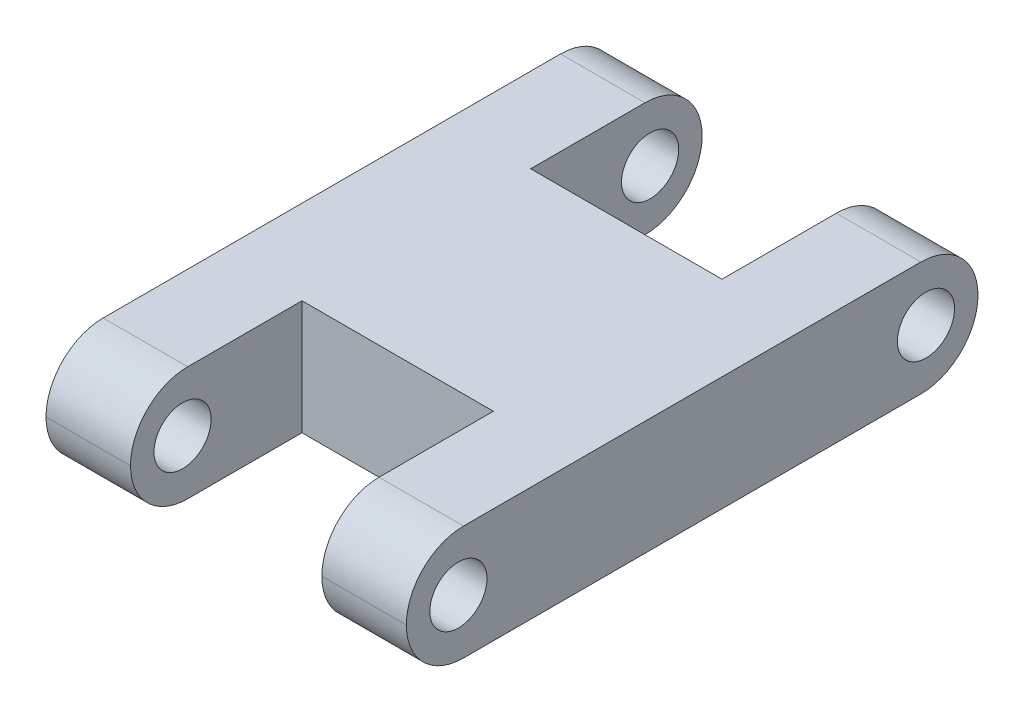
ISO-10303-21;
HEADER;
FILE_DESCRIPTION(('STEP AP214'),'2;1');
FILE_NAME('part.step','',(''),(''),'','','');
FILE_SCHEMA(('AUTOMOTIVE_DESIGN { 1 0 10303 214 1 1 1 1 }'));
ENDSEC;
DATA;
#1=APPLICATION_CONTEXT('core data for automotive mechanical design processes');
#2=APPLICATION_PROTOCOL_DEFINITION('international standard','automotive_design',2000,#1);
#3=PRODUCT_CONTEXT('',#1,'mechanical');
#4=PRODUCT('Part','Part','',(#3));
#5=PRODUCT_RELATED_PRODUCT_CATEGORY('part','',(#4));
#6=PRODUCT_DEFINITION_FORMATION('','',#4);
#7=PRODUCT_DEFINITION_CONTEXT('part definition',#1,'design');
#8=PRODUCT_DEFINITION('design','',#6,#7);
#9=PRODUCT_DEFINITION_SHAPE('','',#8);
#10=(LENGTH_UNIT() NAMED_UNIT(*) SI_UNIT(.MILLI.,.METRE.));
#11=(NAMED_UNIT(*) PLANE_ANGLE_UNIT() SI_UNIT($,.RADIAN.));
#12=(NAMED_UNIT(*) SI_UNIT($,.STERADIAN.) SOLID_ANGLE_UNIT());
#13=UNCERTAINTY_MEASURE_WITH_UNIT(LENGTH_MEASURE(1.E-05),#10,'distance_accuracy_value','');
#14=(GEOMETRIC_REPRESENTATION_CONTEXT(3) GLOBAL_UNCERTAINTY_ASSIGNED_CONTEXT((#13)) GLOBAL_UNIT_ASSIGNED_CONTEXT((#10,
#11,#12)) REPRESENTATION_CONTEXT('',''));
#15=CARTESIAN_POINT('',(0.,0.,0.));
#16=DIRECTION('',(0.,0.,1.));
#17=DIRECTION('',(1.,0.,0.));
#18=AXIS2_PLACEMENT_3D('',#15,#16,#17);
#19=CARTESIAN_POINT('',(7.39220194828621,10.,0.));
#20=DIRECTION('',(-1.,0.,0.));
#21=DIRECTION('',(0.,0.,1.));
#22=AXIS2_PLACEMENT_3D('',#19,#20,#21);
#23=PLANE('',#22);
#24=CARTESIAN_POINT('',(7.39220194828621,5.,4.55217439058586));
#25=DIRECTION('',(-1.,0.,0.));
#26=DIRECTION('',(0.,0.,1.));
#27=AXIS2_PLACEMENT_3D('',#24,#25,#26);
#28=CIRCLE('',#27,2.5);
#29=CARTESIAN_POINT('',(7.39220194828621,5.,7.05217439058586));
#30=VERTEX_POINT('',#29);
#31=EDGE_CURVE('E271',#30,#30,#28,.T.);
#32=ORIENTED_EDGE('',*,*,#31,.T.);
#33=EDGE_LOOP('',(#32));
#34=FACE_BOUND('',#33,.T.);
#35=DIRECTION('',(0.,0.,-1.));
#36=VECTOR('',#35,1.);
#37=CARTESIAN_POINT('',(7.39220194828621,0.,0.));
#38=LINE('',#37,#36);
#39=CARTESIAN_POINT('',(7.39220194828621,0.,15.));
#40=VERTEX_POINT('',#39);
#41=CARTESIAN_POINT('',(7.39220194828621,0.,5.));
#42=VERTEX_POINT('',#41);
#43=EDGE_CURVE('E190',#40,#42,#38,.T.);
#44=ORIENTED_EDGE('',*,*,#43,.T.);
#45=CARTESIAN_POINT('',(7.39220194828621,5.,5.));
#46=DIRECTION('',(-1.,0.,0.));
#47=DIRECTION('',(0.,0.,1.));
#48=AXIS2_PLACEMENT_3D('',#45,#46,#47);
#49=CIRCLE('',#48,5.);
#50=CARTESIAN_POINT('',(7.39220194828621,5.,0.));
#51=VERTEX_POINT('',#50);
#52=EDGE_CURVE('E11',#42,#51,#49,.F.);
#53=ORIENTED_EDGE('',*,*,#52,.T.);
#54=CARTESIAN_POINT('',(7.39220194828621,5.,5.));
#55=DIRECTION('',(-1.,0.,0.));
#56=DIRECTION('',(0.,0.,1.));
#57=AXIS2_PLACEMENT_3D('',#54,#55,#56);
#58=CIRCLE('',#57,5.);
#59=CARTESIAN_POINT('',(7.39220194828621,10.,5.));
#60=VERTEX_POINT('',#59);
#61=EDGE_CURVE('E46',#51,#60,#58,.F.);
#62=ORIENTED_EDGE('',*,*,#61,.T.);
#63=DIRECTION('',(0.,0.,-1.));
#64=VECTOR('',#63,1.);
#65=CARTESIAN_POINT('',(7.39220194828621,10.,0.));
#66=LINE('',#65,#64);
#67=CARTESIAN_POINT('',(7.39220194828621,10.,15.));
#68=VERTEX_POINT('',#67);
#69=EDGE_CURVE('E209',#68,#60,#66,.T.);
#70=ORIENTED_EDGE('',*,*,#69,.F.);
#71=DIRECTION('',(0.,-1.,0.));
#72=VECTOR('',#71,1.);
#73=CARTESIAN_POINT('',(7.39220194828621,10.,15.));
#74=LINE('',#73,#72);
#75=EDGE_CURVE('E189',#68,#40,#74,.T.);
#76=ORIENTED_EDGE('',*,*,#75,.T.);
#77=EDGE_LOOP('',(#44,#53,#62,#70,#76));
#78=FACE_BOUND('',#77,.T.);
#79=ADVANCED_FACE('F37',(#34,#78),#23,.F.);
#80=CARTESIAN_POINT('',(0.,10.,0.));
#81=DIRECTION('',(1.,0.,0.));
#82=DIRECTION('',(0.,0.,-1.));
#83=AXIS2_PLACEMENT_3D('',#80,#81,#82);
#84=PLANE('',#83);
#85=CARTESIAN_POINT('',(0.,5.,45.4478256094141));
#86=DIRECTION('',(-1.,0.,0.));
#87=DIRECTION('',(0.,0.,-1.));
#88=AXIS2_PLACEMENT_3D('',#85,#86,#87);
#89=CIRCLE('',#88,2.49999999999999);
#90=CARTESIAN_POINT('',(0.,5.,42.9478256094141));
#91=VERTEX_POINT('',#90);
#92=EDGE_CURVE('E516',#91,#91,#89,.T.);
#93=ORIENTED_EDGE('',*,*,#92,.F.);
#94=EDGE_LOOP('',(#93));
#95=FACE_BOUND('',#94,.T.);
#96=CARTESIAN_POINT('',(0.,5.,4.55217439058586));
#97=DIRECTION('',(-1.,0.,0.));
#98=DIRECTION('',(0.,0.,1.));
#99=AXIS2_PLACEMENT_3D('',#96,#97,#98);
#100=CIRCLE('',#99,2.5);
#101=CARTESIAN_POINT('',(0.,5.,7.05217439058586));
#102=VERTEX_POINT('',#101);
#103=EDGE_CURVE('E275',#102,#102,#100,.T.);
#104=ORIENTED_EDGE('',*,*,#103,.F.);
#105=EDGE_LOOP('',(#104));
#106=FACE_BOUND('',#105,.T.);
#107=DIRECTION('',(0.,0.,1.));
#108=VECTOR('',#107,1.);
#109=CARTESIAN_POINT('',(0.,0.,0.));
#110=LINE('',#109,#108);
#111=CARTESIAN_POINT('',(0.,0.,5.));
#112=VERTEX_POINT('',#111);
#113=CARTESIAN_POINT('',(0.,0.,45.));
#114=VERTEX_POINT('',#113);
#115=EDGE_CURVE('E192',#112,#114,#110,.T.);
#116=ORIENTED_EDGE('',*,*,#115,.T.);
#117=CARTESIAN_POINT('',(0.,5.,45.));
#118=DIRECTION('',(1.,0.,0.));
#119=DIRECTION('',(0.,0.,-1.));
#120=AXIS2_PLACEMENT_3D('',#117,#118,#119);
#121=CIRCLE('',#120,5.);
#122=CARTESIAN_POINT('',(0.,5.,50.));
#123=VERTEX_POINT('',#122);
#124=EDGE_CURVE('E247',#114,#123,#121,.F.);
#125=ORIENTED_EDGE('',*,*,#124,.T.);
#126=CARTESIAN_POINT('',(0.,5.,45.));
#127=DIRECTION('',(1.,0.,0.));
#128=DIRECTION('',(0.,0.,-1.));
#129=AXIS2_PLACEMENT_3D('',#126,#127,#128);
#130=CIRCLE('',#129,5.);
#131=CARTESIAN_POINT('',(0.,10.,45.));
#132=VERTEX_POINT('',#131);
#133=EDGE_CURVE('E245',#123,#132,#130,.F.);
#134=ORIENTED_EDGE('',*,*,#133,.T.);
#135=DIRECTION('',(0.,0.,1.));
#136=VECTOR('',#135,1.);
#137=CARTESIAN_POINT('',(0.,10.,0.));
#138=LINE('',#137,#136);
#139=CARTESIAN_POINT('',(0.,10.,5.));
#140=VERTEX_POINT('',#139);
#141=EDGE_CURVE('E162',#140,#132,#138,.T.);
#142=ORIENTED_EDGE('',*,*,#141,.F.);
#143=CARTESIAN_POINT('',(0.,5.,5.));
#144=DIRECTION('',(1.,0.,0.));
#145=DIRECTION('',(0.,0.,-1.));
#146=AXIS2_PLACEMENT_3D('',#143,#144,#145);
#147=CIRCLE('',#146,5.);
#148=CARTESIAN_POINT('',(0.,5.,0.));
#149=VERTEX_POINT('',#148);
#150=EDGE_CURVE('E241',#140,#149,#147,.F.);
#151=ORIENTED_EDGE('',*,*,#150,.T.);
#152=CARTESIAN_POINT('',(0.,5.,5.));
#153=DIRECTION('',(1.,0.,0.));
#154=DIRECTION('',(0.,0.,-1.));
#155=AXIS2_PLACEMENT_3D('',#152,#153,#154);
#156=CIRCLE('',#155,5.);
#157=EDGE_CURVE('E243',#149,#112,#156,.F.);
#158=ORIENTED_EDGE('',*,*,#157,.T.);
#159=EDGE_LOOP('',(#116,#125,#134,#142,#151,#158));
#160=FACE_BOUND('',#159,.T.);
#161=ADVANCED_FACE('F308',(#95,#106,#160),#84,.F.);
#162=CARTESIAN_POINT('',(7.39220194828623,10.,0.));
#163=DIRECTION('',(-1.,0.,0.));
#164=DIRECTION('',(0.,0.,1.));
#165=AXIS2_PLACEMENT_3D('',#162,#163,#164);
#166=PLANE('',#165);
#167=CARTESIAN_POINT('',(7.39220194828623,5.,45.4478256094141));
#168=DIRECTION('',(-1.,0.,0.));
#169=DIRECTION('',(0.,0.,1.));
#170=AXIS2_PLACEMENT_3D('',#167,#168,#169);
#171=CIRCLE('',#170,2.49999999999999);
#172=CARTESIAN_POINT('',(7.39220194828623,5.,47.9478256094141));
#173=VERTEX_POINT('',#172);
#174=EDGE_CURVE('E281',#173,#173,#171,.T.);
#175=ORIENTED_EDGE('',*,*,#174,.T.);
#176=EDGE_LOOP('',(#175));
#177=FACE_BOUND('',#176,.T.);
#178=CARTESIAN_POINT('',(7.39220194828623,5.,45.));
#179=DIRECTION('',(-1.,0.,0.));
#180=DIRECTION('',(0.,0.,1.));
#181=AXIS2_PLACEMENT_3D('',#178,#179,#180);
#182=CIRCLE('',#181,5.);
#183=CARTESIAN_POINT('',(7.39220194828623,10.,45.));
#184=VERTEX_POINT('',#183);
#185=CARTESIAN_POINT('',(7.39220194828623,5.,50.));
#186=VERTEX_POINT('',#185);
#187=EDGE_CURVE('E237',#184,#186,#182,.F.);
#188=ORIENTED_EDGE('',*,*,#187,.T.);
#189=CARTESIAN_POINT('',(7.39220194828623,5.,45.));
#190=DIRECTION('',(-1.,0.,0.));
#191=DIRECTION('',(0.,0.,1.));
#192=AXIS2_PLACEMENT_3D('',#189,#190,#191);
#193=CIRCLE('',#192,5.);
#194=CARTESIAN_POINT('',(7.39220194828623,0.,45.));
#195=VERTEX_POINT('',#194);
#196=EDGE_CURVE('E239',#186,#195,#193,.F.);
#197=ORIENTED_EDGE('',*,*,#196,.T.);
#198=DIRECTION('',(0.,0.,-1.));
#199=VECTOR('',#198,1.);
#200=CARTESIAN_POINT('',(7.39220194828623,0.,0.));
#201=LINE('',#200,#199);
#202=CARTESIAN_POINT('',(7.39220194828623,0.,35.));
#203=VERTEX_POINT('',#202);
#204=EDGE_CURVE('E168',#195,#203,#201,.T.);
#205=ORIENTED_EDGE('',*,*,#204,.T.);
#206=DIRECTION('',(0.,-1.,0.));
#207=VECTOR('',#206,1.);
#208=CARTESIAN_POINT('',(7.39220194828623,10.,35.));
#209=LINE('',#208,#207);
#210=CARTESIAN_POINT('',(7.39220194828623,10.,35.));
#211=VERTEX_POINT('',#210);
#212=EDGE_CURVE('E165',#211,#203,#209,.T.);
#213=ORIENTED_EDGE('',*,*,#212,.F.);
#214=DIRECTION('',(0.,0.,-1.));
#215=VECTOR('',#214,1.);
#216=CARTESIAN_POINT('',(7.39220194828623,10.,0.));
#217=LINE('',#216,#215);
#218=EDGE_CURVE('E150',#184,#211,#217,.T.);
#219=ORIENTED_EDGE('',*,*,#218,.F.);
#220=EDGE_LOOP('',(#188,#197,#205,#213,#219));
#221=FACE_BOUND('',#220,.T.);
#222=ADVANCED_FACE('F166',(#177,#221),#166,.F.);
#223=CARTESIAN_POINT('',(0.,10.,35.));
#224=DIRECTION('',(0.,0.,-1.));
#225=DIRECTION('',(-1.,0.,0.));
#226=AXIS2_PLACEMENT_3D('',#223,#224,#225);
#227=PLANE('',#226);
#228=DIRECTION('',(1.,0.,0.));
#229=VECTOR('',#228,1.);
#230=CARTESIAN_POINT('',(0.,0.,35.));
#231=LINE('',#230,#229);
#232=CARTESIAN_POINT('',(24.1278451788051,0.,35.));
#233=VERTEX_POINT('',#232);
#234=EDGE_CURVE('E197',#203,#233,#231,.T.);
#235=ORIENTED_EDGE('',*,*,#234,.T.);
#236=DIRECTION('',(0.,-1.,0.));
#237=VECTOR('',#236,1.);
#238=CARTESIAN_POINT('',(24.1278451788051,10.,35.));
#239=LINE('',#238,#237);
#240=CARTESIAN_POINT('',(24.1278451788051,10.,35.));
#241=VERTEX_POINT('',#240);
#242=EDGE_CURVE('E173',#241,#233,#239,.T.);
#243=ORIENTED_EDGE('',*,*,#242,.F.);
#244=DIRECTION('',(1.,0.,0.));
#245=VECTOR('',#244,1.);
#246=CARTESIAN_POINT('',(0.,10.,35.));
#247=LINE('',#246,#245);
#248=EDGE_CURVE('E156',#211,#241,#247,.T.);
#249=ORIENTED_EDGE('',*,*,#248,.F.);
#250=ORIENTED_EDGE('',*,*,#212,.T.);
#251=EDGE_LOOP('',(#235,#243,#249,#250));
#252=FACE_BOUND('',#251,.T.);
#253=ADVANCED_FACE('F175',(#252),#227,.F.);
#254=CARTESIAN_POINT('',(24.1278451788051,10.,0.));
#255=DIRECTION('',(-1.,0.,0.));
#256=DIRECTION('',(0.,0.,1.));
#257=AXIS2_PLACEMENT_3D('',#254,#255,#256);
#258=PLANE('',#257);
#259=CARTESIAN_POINT('',(24.1278451788051,5.,45.4478256094141));
#260=DIRECTION('',(-1.,0.,0.));
#261=DIRECTION('',(0.,0.,1.));
#262=AXIS2_PLACEMENT_3D('',#259,#260,#261);
#263=CIRCLE('',#262,2.49999999999999);
#264=CARTESIAN_POINT('',(24.1278451788051,5.,47.9478256094141));
#265=VERTEX_POINT('',#264);
#266=EDGE_CURVE('E286',#265,#265,#263,.T.);
#267=ORIENTED_EDGE('',*,*,#266,.F.);
#268=EDGE_LOOP('',(#267));
#269=FACE_BOUND('',#268,.T.);
#270=DIRECTION('',(0.,0.,-1.));
#271=VECTOR('',#270,1.);
#272=CARTESIAN_POINT('',(24.1278451788051,0.,0.));
#273=LINE('',#272,#271);
#274=CARTESIAN_POINT('',(24.1278451788051,0.,45.));
#275=VERTEX_POINT('',#274);
#276=EDGE_CURVE('E199',#275,#233,#273,.T.);
#277=ORIENTED_EDGE('',*,*,#276,.F.);
#278=CARTESIAN_POINT('',(24.1278451788051,5.,45.));
#279=DIRECTION('',(-1.,0.,0.));
#280=DIRECTION('',(0.,0.,1.));
#281=AXIS2_PLACEMENT_3D('',#278,#279,#280);
#282=CIRCLE('',#281,5.);
#283=CARTESIAN_POINT('',(24.1278451788051,5.,50.));
#284=VERTEX_POINT('',#283);
#285=EDGE_CURVE('E227',#275,#284,#282,.T.);
#286=ORIENTED_EDGE('',*,*,#285,.T.);
#287=CARTESIAN_POINT('',(24.1278451788051,5.,45.));
#288=DIRECTION('',(-1.,0.,0.));
#289=DIRECTION('',(0.,0.,1.));
#290=AXIS2_PLACEMENT_3D('',#287,#288,#289);
#291=CIRCLE('',#290,5.);
#292=CARTESIAN_POINT('',(24.1278451788051,10.,45.));
#293=VERTEX_POINT('',#292);
#294=EDGE_CURVE('E225',#284,#293,#291,.T.);
#295=ORIENTED_EDGE('',*,*,#294,.T.);
#296=DIRECTION('',(0.,0.,-1.));
#297=VECTOR('',#296,1.);
#298=CARTESIAN_POINT('',(24.1278451788051,10.,0.));
#299=LINE('',#298,#297);
#300=EDGE_CURVE('E177',#293,#241,#299,.T.);
#301=ORIENTED_EDGE('',*,*,#300,.T.);
#302=ORIENTED_EDGE('',*,*,#242,.T.);
#303=EDGE_LOOP('',(#277,#286,#295,#301,#302));
#304=FACE_BOUND('',#303,.T.);
#305=ADVANCED_FACE('F350',(#269,#304),#258,.T.);
#306=CARTESIAN_POINT('',(31.5200471270914,10.,0.));
#307=DIRECTION('',(1.,0.,0.));
#308=DIRECTION('',(0.,0.,-1.));
#309=AXIS2_PLACEMENT_3D('',#306,#307,#308);
#310=PLANE('',#309);
#311=CARTESIAN_POINT('',(31.5200471270914,5.,45.4478256094141));
#312=DIRECTION('',(1.,0.,0.));
#313=DIRECTION('',(0.,0.,-1.));
#314=AXIS2_PLACEMENT_3D('',#311,#312,#313);
#315=CIRCLE('',#314,2.49999999999999);
#316=CARTESIAN_POINT('',(31.5200471270914,5.,42.9478256094141));
#317=VERTEX_POINT('',#316);
#318=EDGE_CURVE('E41',#317,#317,#315,.T.);
#319=ORIENTED_EDGE('',*,*,#318,.F.);
#320=EDGE_LOOP('',(#319));
#321=FACE_BOUND('',#320,.T.);
#322=CARTESIAN_POINT('',(31.5200471270914,5.,4.55217439058586));
#323=DIRECTION('',(1.,0.,0.));
#324=DIRECTION('',(0.,0.,-1.));
#325=AXIS2_PLACEMENT_3D('',#322,#323,#324);
#326=CIRCLE('',#325,2.5);
#327=CARTESIAN_POINT('',(31.5200471270914,5.,2.05217439058586));
#328=VERTEX_POINT('',#327);
#329=EDGE_CURVE('E274',#328,#328,#326,.T.);
#330=ORIENTED_EDGE('',*,*,#329,.F.);
#331=EDGE_LOOP('',(#330));
#332=FACE_BOUND('',#331,.T.);
#333=CARTESIAN_POINT('',(31.5200471270914,5.,45.));
#334=DIRECTION('',(1.,0.,0.));
#335=DIRECTION('',(0.,0.,-1.));
#336=AXIS2_PLACEMENT_3D('',#333,#334,#335);
#337=CIRCLE('',#336,5.);
#338=CARTESIAN_POINT('',(31.5200471270914,10.,45.));
#339=VERTEX_POINT('',#338);
#340=CARTESIAN_POINT('',(31.5200471270914,5.,50.));
#341=VERTEX_POINT('',#340);
#342=EDGE_CURVE('E233',#339,#341,#337,.T.);
#343=ORIENTED_EDGE('',*,*,#342,.T.);
#344=CARTESIAN_POINT('',(31.5200471270914,5.,45.));
#345=DIRECTION('',(1.,0.,0.));
#346=DIRECTION('',(0.,0.,-1.));
#347=AXIS2_PLACEMENT_3D('',#344,#345,#346);
#348=CIRCLE('',#347,5.);
#349=CARTESIAN_POINT('',(31.5200471270914,0.,45.));
#350=VERTEX_POINT('',#349);
#351=EDGE_CURVE('E235',#341,#350,#348,.T.);
#352=ORIENTED_EDGE('',*,*,#351,.T.);
#353=DIRECTION('',(0.,0.,1.));
#354=VECTOR('',#353,1.);
#355=CARTESIAN_POINT('',(31.5200471270914,0.,0.));
#356=LINE('',#355,#354);
#357=CARTESIAN_POINT('',(31.5200471270914,0.,5.));
#358=VERTEX_POINT('',#357);
#359=EDGE_CURVE('E201',#358,#350,#356,.T.);
#360=ORIENTED_EDGE('',*,*,#359,.F.);
#361=CARTESIAN_POINT('',(31.5200471270914,5.,5.));
#362=DIRECTION('',(1.,0.,0.));
#363=DIRECTION('',(0.,0.,-1.));
#364=AXIS2_PLACEMENT_3D('',#361,#362,#363);
#365=CIRCLE('',#364,5.);
#366=CARTESIAN_POINT('',(31.5200471270914,5.,0.));
#367=VERTEX_POINT('',#366);
#368=EDGE_CURVE('E229',#358,#367,#365,.T.);
#369=ORIENTED_EDGE('',*,*,#368,.T.);
#370=CARTESIAN_POINT('',(31.5200471270914,5.,5.));
#371=DIRECTION('',(1.,0.,0.));
#372=DIRECTION('',(0.,0.,-1.));
#373=AXIS2_PLACEMENT_3D('',#370,#371,#372);
#374=CIRCLE('',#373,5.);
#375=CARTESIAN_POINT('',(31.5200471270914,10.,5.));
#376=VERTEX_POINT('',#375);
#377=EDGE_CURVE('E231',#367,#376,#374,.T.);
#378=ORIENTED_EDGE('',*,*,#377,.T.);
#379=DIRECTION('',(0.,0.,1.));
#380=VECTOR('',#379,1.);
#381=CARTESIAN_POINT('',(31.5200471270914,10.,0.));
#382=LINE('',#381,#380);
#383=EDGE_CURVE('E179',#376,#339,#382,.T.);
#384=ORIENTED_EDGE('',*,*,#383,.T.);
#385=EDGE_LOOP('',(#343,#352,#360,#369,#378,#384));
#386=FACE_BOUND('',#385,.T.);
#387=ADVANCED_FACE('F336',(#321,#332,#386),#310,.T.);
#388=CARTESIAN_POINT('',(24.1278451788052,10.,0.));
#389=DIRECTION('',(-1.,0.,0.));
#390=DIRECTION('',(0.,0.,1.));
#391=AXIS2_PLACEMENT_3D('',#388,#389,#390);
#392=PLANE('',#391);
#393=CARTESIAN_POINT('',(24.1278451788052,5.,4.55217439058586));
#394=DIRECTION('',(-1.,0.,0.));
#395=DIRECTION('',(0.,0.,1.));
#396=AXIS2_PLACEMENT_3D('',#393,#394,#395);
#397=CIRCLE('',#396,2.5);
#398=CARTESIAN_POINT('',(24.1278451788052,5.,7.05217439058586));
#399=VERTEX_POINT('',#398);
#400=EDGE_CURVE('E272',#399,#399,#397,.T.);
#401=ORIENTED_EDGE('',*,*,#400,.F.);
#402=EDGE_LOOP('',(#401));
#403=FACE_BOUND('',#402,.T.);
#404=DIRECTION('',(0.,0.,-1.));
#405=VECTOR('',#404,1.);
#406=CARTESIAN_POINT('',(24.1278451788052,10.,0.));
#407=LINE('',#406,#405);
#408=CARTESIAN_POINT('',(24.1278451788052,10.,15.));
#409=VERTEX_POINT('',#408);
#410=CARTESIAN_POINT('',(24.1278451788052,10.,5.));
#411=VERTEX_POINT('',#410);
#412=EDGE_CURVE('E185',#409,#411,#407,.T.);
#413=ORIENTED_EDGE('',*,*,#412,.T.);
#414=CARTESIAN_POINT('',(24.1278451788052,5.,5.));
#415=DIRECTION('',(-1.,0.,0.));
#416=DIRECTION('',(0.,0.,1.));
#417=AXIS2_PLACEMENT_3D('',#414,#415,#416);
#418=CIRCLE('',#417,5.);
#419=CARTESIAN_POINT('',(24.1278451788052,5.,0.));
#420=VERTEX_POINT('',#419);
#421=EDGE_CURVE('E60',#411,#420,#418,.T.);
#422=ORIENTED_EDGE('',*,*,#421,.T.);
#423=CARTESIAN_POINT('',(24.1278451788052,5.,5.));
#424=DIRECTION('',(-1.,0.,0.));
#425=DIRECTION('',(0.,0.,1.));
#426=AXIS2_PLACEMENT_3D('',#423,#424,#425);
#427=CIRCLE('',#426,5.);
#428=CARTESIAN_POINT('',(24.1278451788052,0.,5.));
#429=VERTEX_POINT('',#428);
#430=EDGE_CURVE('E257',#420,#429,#427,.T.);
#431=ORIENTED_EDGE('',*,*,#430,.T.);
#432=DIRECTION('',(0.,0.,-1.));
#433=VECTOR('',#432,1.);
#434=CARTESIAN_POINT('',(24.1278451788052,0.,0.));
#435=LINE('',#434,#433);
#436=CARTESIAN_POINT('',(24.1278451788052,0.,15.));
#437=VERTEX_POINT('',#436);
#438=EDGE_CURVE('E204',#437,#429,#435,.T.);
#439=ORIENTED_EDGE('',*,*,#438,.F.);
#440=DIRECTION('',(0.,-1.,0.));
#441=VECTOR('',#440,1.);
#442=CARTESIAN_POINT('',(24.1278451788052,10.,15.));
#443=LINE('',#442,#441);
#444=EDGE_CURVE('E212',#409,#437,#443,.T.);
#445=ORIENTED_EDGE('',*,*,#444,.F.);
#446=EDGE_LOOP('',(#413,#422,#431,#439,#445));
#447=FACE_BOUND('',#446,.T.);
#448=ADVANCED_FACE('F325',(#403,#447),#392,.T.);
#449=CARTESIAN_POINT('',(0.,10.,15.));
#450=DIRECTION('',(0.,0.,1.));
#451=DIRECTION('',(1.,0.,0.));
#452=AXIS2_PLACEMENT_3D('',#449,#450,#451);
#453=PLANE('',#452);
#454=DIRECTION('',(-1.,0.,0.));
#455=VECTOR('',#454,1.);
#456=CARTESIAN_POINT('',(0.,0.,15.));
#457=LINE('',#456,#455);
#458=EDGE_CURVE('E207',#437,#40,#457,.T.);
#459=ORIENTED_EDGE('',*,*,#458,.T.);
#460=ORIENTED_EDGE('',*,*,#75,.F.);
#461=DIRECTION('',(-1.,0.,0.));
#462=VECTOR('',#461,1.);
#463=CARTESIAN_POINT('',(0.,10.,15.));
#464=LINE('',#463,#462);
#465=EDGE_CURVE('E187',#409,#68,#464,.T.);
#466=ORIENTED_EDGE('',*,*,#465,.F.);
#467=ORIENTED_EDGE('',*,*,#444,.T.);
#468=EDGE_LOOP('',(#459,#460,#466,#467));
#469=FACE_BOUND('',#468,.T.);
#470=ADVANCED_FACE('F321',(#469),#453,.F.);
#471=CARTESIAN_POINT('',(0.,10.,0.));
#472=DIRECTION('',(0.,1.,0.));
#473=DIRECTION('',(0.,0.,1.));
#474=AXIS2_PLACEMENT_3D('',#471,#472,#473);
#475=PLANE('',#474);
#476=ORIENTED_EDGE('',*,*,#141,.T.);
#477=DIRECTION('',(1.,0.,0.));
#478=VECTOR('',#477,1.);
#479=CARTESIAN_POINT('',(7.39220194828623,10.,45.));
#480=LINE('',#479,#478);
#481=EDGE_CURVE('E159',#132,#184,#480,.T.);
#482=ORIENTED_EDGE('',*,*,#481,.T.);
#483=ORIENTED_EDGE('',*,*,#218,.T.);
#484=ORIENTED_EDGE('',*,*,#248,.T.);
#485=ORIENTED_EDGE('',*,*,#300,.F.);
#486=DIRECTION('',(-1.,0.,0.));
#487=VECTOR('',#486,1.);
#488=CARTESIAN_POINT('',(0.,10.,45.));
#489=LINE('',#488,#487);
#490=EDGE_CURVE('E254',#293,#339,#489,.F.);
#491=ORIENTED_EDGE('',*,*,#490,.T.);
#492=ORIENTED_EDGE('',*,*,#383,.F.);
#493=DIRECTION('',(1.,0.,0.));
#494=VECTOR('',#493,1.);
#495=CARTESIAN_POINT('',(0.,10.,5.));
#496=LINE('',#495,#494);
#497=EDGE_CURVE('E251',#376,#411,#496,.F.);
#498=ORIENTED_EDGE('',*,*,#497,.T.);
#499=ORIENTED_EDGE('',*,*,#412,.F.);
#500=ORIENTED_EDGE('',*,*,#465,.T.);
#501=ORIENTED_EDGE('',*,*,#69,.T.);
#502=DIRECTION('',(-1.,0.,0.));
#503=VECTOR('',#502,1.);
#504=CARTESIAN_POINT('',(0.,10.,5.));
#505=LINE('',#504,#503);
#506=EDGE_CURVE('E249',#60,#140,#505,.T.);
#507=ORIENTED_EDGE('',*,*,#506,.T.);
#508=EDGE_LOOP('',(#476,#482,#483,#484,#485,#491,#492,#498,#499,#500,#501,#507));
#509=FACE_BOUND('',#508,.T.);
#510=ADVANCED_FACE('F153',(#509),#475,.T.);
#511=CARTESIAN_POINT('',(0.,0.,0.));
#512=DIRECTION('',(0.,1.,0.));
#513=DIRECTION('',(0.,0.,1.));
#514=AXIS2_PLACEMENT_3D('',#511,#512,#513);
#515=PLANE('',#514);
#516=ORIENTED_EDGE('',*,*,#359,.T.);
#517=DIRECTION('',(-1.,0.,0.));
#518=VECTOR('',#517,1.);
#519=CARTESIAN_POINT('',(24.1278451788051,0.,45.));
#520=LINE('',#519,#518);
#521=EDGE_CURVE('E222',#350,#275,#520,.T.);
#522=ORIENTED_EDGE('',*,*,#521,.T.);
#523=ORIENTED_EDGE('',*,*,#276,.T.);
#524=ORIENTED_EDGE('',*,*,#234,.F.);
#525=ORIENTED_EDGE('',*,*,#204,.F.);
#526=DIRECTION('',(1.,0.,0.));
#527=VECTOR('',#526,1.);
#528=CARTESIAN_POINT('',(0.,0.,45.));
#529=LINE('',#528,#527);
#530=EDGE_CURVE('E219',#195,#114,#529,.F.);
#531=ORIENTED_EDGE('',*,*,#530,.T.);
#532=ORIENTED_EDGE('',*,*,#115,.F.);
#533=DIRECTION('',(-1.,0.,0.));
#534=VECTOR('',#533,1.);
#535=CARTESIAN_POINT('',(0.,0.,5.));
#536=LINE('',#535,#534);
#537=EDGE_CURVE('E172',#112,#42,#536,.F.);
#538=ORIENTED_EDGE('',*,*,#537,.T.);
#539=ORIENTED_EDGE('',*,*,#43,.F.);
#540=ORIENTED_EDGE('',*,*,#458,.F.);
#541=ORIENTED_EDGE('',*,*,#438,.T.);
#542=DIRECTION('',(1.,0.,0.));
#543=VECTOR('',#542,1.);
#544=CARTESIAN_POINT('',(31.5200471270914,0.,5.));
#545=LINE('',#544,#543);
#546=EDGE_CURVE('E217',#429,#358,#545,.T.);
#547=ORIENTED_EDGE('',*,*,#546,.T.);
#548=EDGE_LOOP('',(#516,#522,#523,#524,#525,#531,#532,#538,#539,#540,#541,#547));
#549=FACE_BOUND('',#548,.T.);
#550=ADVANCED_FACE('F305',(#549),#515,.F.);
#551=CARTESIAN_POINT('',(0.,5.,45.));
#552=DIRECTION('',(-1.,0.,0.));
#553=DIRECTION('',(0.,0.,1.));
#554=AXIS2_PLACEMENT_3D('',#551,#552,#553);
#555=CYLINDRICAL_SURFACE('',#554,5.);
#556=DIRECTION('',(-1.,0.,0.));
#557=VECTOR('',#556,1.);
#558=CARTESIAN_POINT('',(0.,5.,50.));
#559=LINE('',#558,#557);
#560=EDGE_CURVE('E193',#341,#284,#559,.T.);
#561=ORIENTED_EDGE('',*,*,#560,.F.);
#562=ORIENTED_EDGE('',*,*,#342,.F.);
#563=ORIENTED_EDGE('',*,*,#490,.F.);
#564=ORIENTED_EDGE('',*,*,#294,.F.);
#565=EDGE_LOOP('',(#561,#562,#563,#564));
#566=FACE_BOUND('',#565,.T.);
#567=ADVANCED_FACE('F343',(#566),#555,.T.);
#568=CARTESIAN_POINT('',(0.,5.,45.));
#569=DIRECTION('',(1.,0.,0.));
#570=DIRECTION('',(0.,0.,-1.));
#571=AXIS2_PLACEMENT_3D('',#568,#569,#570);
#572=CYLINDRICAL_SURFACE('',#571,5.);
#573=ORIENTED_EDGE('',*,*,#351,.F.);
#574=ORIENTED_EDGE('',*,*,#560,.T.);
#575=ORIENTED_EDGE('',*,*,#285,.F.);
#576=ORIENTED_EDGE('',*,*,#521,.F.);
#577=EDGE_LOOP('',(#573,#574,#575,#576));
#578=FACE_BOUND('',#577,.T.);
#579=ADVANCED_FACE('F348',(#578),#572,.T.);
#580=CARTESIAN_POINT('',(0.,5.,45.));
#581=DIRECTION('',(-1.,0.,0.));
#582=DIRECTION('',(0.,0.,1.));
#583=AXIS2_PLACEMENT_3D('',#580,#581,#582);
#584=CYLINDRICAL_SURFACE('',#583,5.);
#585=ORIENTED_EDGE('',*,*,#481,.F.);
#586=ORIENTED_EDGE('',*,*,#133,.F.);
#587=DIRECTION('',(1.,0.,0.));
#588=VECTOR('',#587,1.);
#589=CARTESIAN_POINT('',(0.,5.,50.));
#590=LINE('',#589,#588);
#591=EDGE_CURVE('E263',#186,#123,#590,.F.);
#592=ORIENTED_EDGE('',*,*,#591,.F.);
#593=ORIENTED_EDGE('',*,*,#187,.F.);
#594=EDGE_LOOP('',(#585,#586,#592,#593));
#595=FACE_BOUND('',#594,.T.);
#596=ADVANCED_FACE('F299',(#595),#584,.T.);
#597=CARTESIAN_POINT('',(0.,5.,45.));
#598=DIRECTION('',(1.,0.,0.));
#599=DIRECTION('',(0.,0.,-1.));
#600=AXIS2_PLACEMENT_3D('',#597,#598,#599);
#601=CYLINDRICAL_SURFACE('',#600,5.);
#602=ORIENTED_EDGE('',*,*,#124,.F.);
#603=ORIENTED_EDGE('',*,*,#530,.F.);
#604=ORIENTED_EDGE('',*,*,#196,.F.);
#605=ORIENTED_EDGE('',*,*,#591,.T.);
#606=EDGE_LOOP('',(#602,#603,#604,#605));
#607=FACE_BOUND('',#606,.T.);
#608=ADVANCED_FACE('F307',(#607),#601,.T.);
#609=CARTESIAN_POINT('',(0.,5.,5.));
#610=DIRECTION('',(-1.,0.,0.));
#611=DIRECTION('',(0.,0.,1.));
#612=AXIS2_PLACEMENT_3D('',#609,#610,#611);
#613=CYLINDRICAL_SURFACE('',#612,5.);
#614=ORIENTED_EDGE('',*,*,#546,.F.);
#615=ORIENTED_EDGE('',*,*,#430,.F.);
#616=DIRECTION('',(1.,0.,0.));
#617=VECTOR('',#616,1.);
#618=CARTESIAN_POINT('',(24.1278451788052,5.,0.));
#619=LINE('',#618,#617);
#620=EDGE_CURVE('E266',#367,#420,#619,.F.);
#621=ORIENTED_EDGE('',*,*,#620,.F.);
#622=ORIENTED_EDGE('',*,*,#368,.F.);
#623=EDGE_LOOP('',(#614,#615,#621,#622));
#624=FACE_BOUND('',#623,.T.);
#625=ADVANCED_FACE('F328',(#624),#613,.T.);
#626=CARTESIAN_POINT('',(0.,5.,5.));
#627=DIRECTION('',(1.,0.,0.));
#628=DIRECTION('',(0.,0.,-1.));
#629=AXIS2_PLACEMENT_3D('',#626,#627,#628);
#630=CYLINDRICAL_SURFACE('',#629,5.);
#631=ORIENTED_EDGE('',*,*,#421,.F.);
#632=ORIENTED_EDGE('',*,*,#497,.F.);
#633=ORIENTED_EDGE('',*,*,#377,.F.);
#634=ORIENTED_EDGE('',*,*,#620,.T.);
#635=EDGE_LOOP('',(#631,#632,#633,#634));
#636=FACE_BOUND('',#635,.T.);
#637=ADVANCED_FACE('F332',(#636),#630,.T.);
#638=CARTESIAN_POINT('',(0.,5.,5.));
#639=DIRECTION('',(1.,0.,0.));
#640=DIRECTION('',(0.,0.,-1.));
#641=AXIS2_PLACEMENT_3D('',#638,#639,#640);
#642=CYLINDRICAL_SURFACE('',#641,5.);
#643=ORIENTED_EDGE('',*,*,#506,.F.);
#644=ORIENTED_EDGE('',*,*,#61,.F.);
#645=DIRECTION('',(-1.,0.,0.));
#646=VECTOR('',#645,1.);
#647=CARTESIAN_POINT('',(7.39220194828621,5.,0.));
#648=LINE('',#647,#646);
#649=EDGE_CURVE('E269',#149,#51,#648,.F.);
#650=ORIENTED_EDGE('',*,*,#649,.F.);
#651=ORIENTED_EDGE('',*,*,#150,.F.);
#652=EDGE_LOOP('',(#643,#644,#650,#651));
#653=FACE_BOUND('',#652,.T.);
#654=ADVANCED_FACE('F39',(#653),#642,.T.);
#655=CARTESIAN_POINT('',(0.,5.,5.));
#656=DIRECTION('',(-1.,0.,0.));
#657=DIRECTION('',(0.,0.,1.));
#658=AXIS2_PLACEMENT_3D('',#655,#656,#657);
#659=CYLINDRICAL_SURFACE('',#658,5.);
#660=ORIENTED_EDGE('',*,*,#52,.F.);
#661=ORIENTED_EDGE('',*,*,#537,.F.);
#662=ORIENTED_EDGE('',*,*,#157,.F.);
#663=ORIENTED_EDGE('',*,*,#649,.T.);
#664=EDGE_LOOP('',(#660,#661,#662,#663));
#665=FACE_BOUND('',#664,.T.);
#666=ADVANCED_FACE('F313',(#665),#659,.T.);
#667=CARTESIAN_POINT('',(50.,5.,4.55217439058586));
#668=DIRECTION('',(-1.,0.,0.));
#669=DIRECTION('',(0.,0.,1.));
#670=AXIS2_PLACEMENT_3D('',#667,#668,#669);
#671=CYLINDRICAL_SURFACE('',#670,2.5);
#672=ORIENTED_EDGE('',*,*,#329,.T.);
#673=EDGE_LOOP('',(#672));
#674=FACE_BOUND('',#673,.T.);
#675=ORIENTED_EDGE('',*,*,#400,.T.);
#676=EDGE_LOOP('',(#675));
#677=FACE_BOUND('',#676,.T.);
#678=ADVANCED_FACE('F384',(#674,#677),#671,.F.);
#679=ORIENTED_EDGE('',*,*,#103,.T.);
#680=EDGE_LOOP('',(#679));
#681=FACE_BOUND('',#680,.T.);
#682=ORIENTED_EDGE('',*,*,#31,.F.);
#683=EDGE_LOOP('',(#682));
#684=FACE_BOUND('',#683,.T.);
#685=ADVANCED_FACE('F389',(#681,#684),#671,.F.);
#686=CARTESIAN_POINT('',(50.,5.,45.4478256094141));
#687=DIRECTION('',(-1.,0.,0.));
#688=DIRECTION('',(0.,0.,1.));
#689=AXIS2_PLACEMENT_3D('',#686,#687,#688);
#690=CYLINDRICAL_SURFACE('',#689,2.49999999999999);
#691=ORIENTED_EDGE('',*,*,#266,.T.);
#692=EDGE_LOOP('',(#691));
#693=FACE_BOUND('',#692,.T.);
#694=ORIENTED_EDGE('',*,*,#318,.T.);
#695=EDGE_LOOP('',(#694));
#696=FACE_BOUND('',#695,.T.);
#697=ADVANCED_FACE('F492',(#693,#696),#690,.F.);
#698=ORIENTED_EDGE('',*,*,#92,.T.);
#699=EDGE_LOOP('',(#698));
#700=FACE_BOUND('',#699,.T.);
#701=ORIENTED_EDGE('',*,*,#174,.F.);
#702=EDGE_LOOP('',(#701));
#703=FACE_BOUND('',#702,.T.);
#704=ADVANCED_FACE('F499',(#700,#703),#690,.F.);
#705=CLOSED_SHELL('',(#79,#161,#222,#253,#305,#387,#448,#470,#510,#550,#567,#579,#596,#608,#625,
#637,#654,#666,#678,#685,#697,#704));
#706=MANIFOLD_SOLID_BREP('B2',#705);
#707=ADVANCED_BREP_SHAPE_REPRESENTATION('',(#18,#706),#14);
#708=SHAPE_DEFINITION_REPRESENTATION(#9,#707);
ENDSEC;
END-ISO-10303-21;
